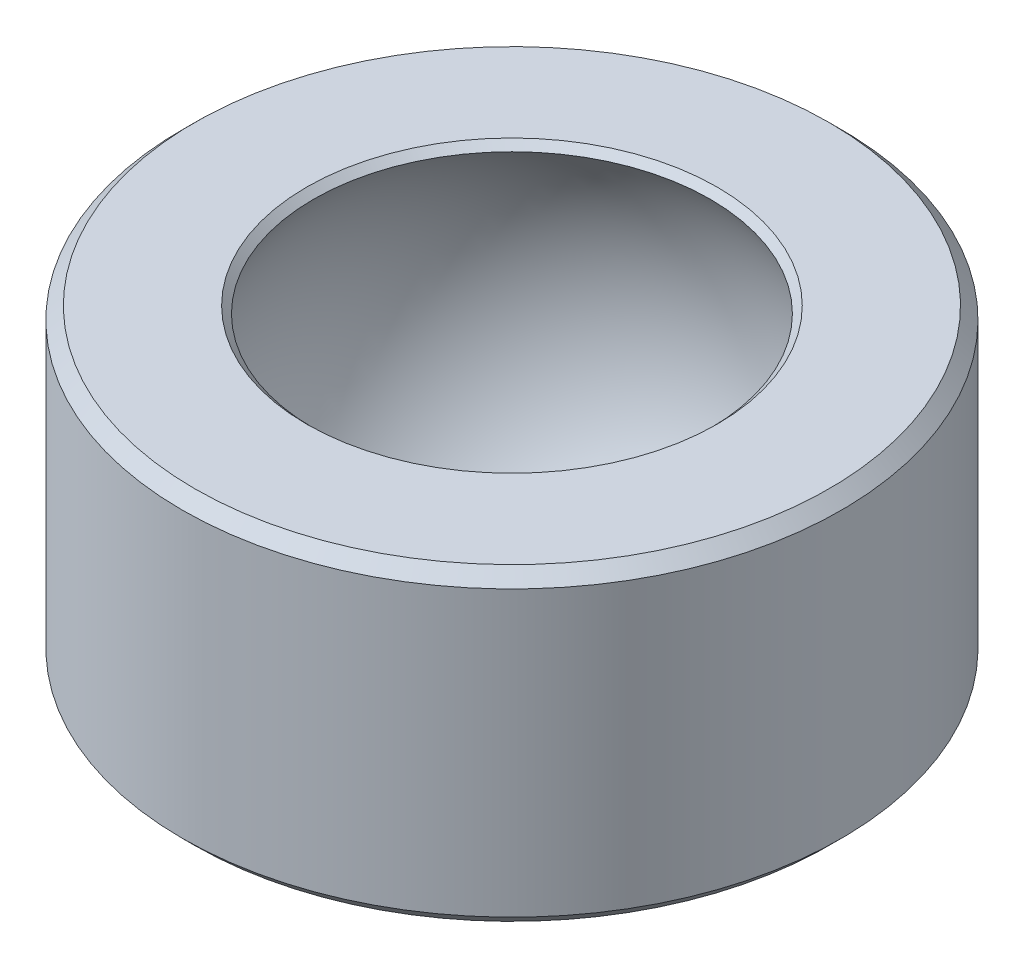
ISO-10303-21;
HEADER;
FILE_DESCRIPTION(('STEP AP214'),'2;1');
FILE_NAME('part.step','',(''),(''),'','','');
FILE_SCHEMA(('AUTOMOTIVE_DESIGN { 1 0 10303 214 1 1 1 1 }'));
ENDSEC;
DATA;
#1=APPLICATION_CONTEXT('core data for automotive mechanical design processes');
#2=APPLICATION_PROTOCOL_DEFINITION('international standard','automotive_design',2000,#1);
#3=PRODUCT_CONTEXT('',#1,'mechanical');
#4=PRODUCT('Part','Part','',(#3));
#5=PRODUCT_RELATED_PRODUCT_CATEGORY('part','',(#4));
#6=PRODUCT_DEFINITION_FORMATION('','',#4);
#7=PRODUCT_DEFINITION_CONTEXT('part definition',#1,'design');
#8=PRODUCT_DEFINITION('design','',#6,#7);
#9=PRODUCT_DEFINITION_SHAPE('','',#8);
#10=(LENGTH_UNIT() NAMED_UNIT(*) SI_UNIT(.MILLI.,.METRE.));
#11=(NAMED_UNIT(*) PLANE_ANGLE_UNIT() SI_UNIT($,.RADIAN.));
#12=(NAMED_UNIT(*) SI_UNIT($,.STERADIAN.) SOLID_ANGLE_UNIT());
#13=UNCERTAINTY_MEASURE_WITH_UNIT(LENGTH_MEASURE(1.E-05),#10,'distance_accuracy_value','');
#14=(GEOMETRIC_REPRESENTATION_CONTEXT(3) GLOBAL_UNCERTAINTY_ASSIGNED_CONTEXT((#13)) GLOBAL_UNIT_ASSIGNED_CONTEXT((#10,
#11,#12)) REPRESENTATION_CONTEXT('',''));
#15=CARTESIAN_POINT('',(0.,0.,0.));
#16=DIRECTION('',(0.,0.,1.));
#17=DIRECTION('',(1.,0.,0.));
#18=AXIS2_PLACEMENT_3D('',#15,#16,#17);
#19=CARTESIAN_POINT('',(0.,-1.875,0.));
#20=DIRECTION('',(0.,1.,0.));
#21=DIRECTION('',(0.,0.,1.));
#22=AXIS2_PLACEMENT_3D('',#19,#20,#21);
#23=CYLINDRICAL_SURFACE('',#22,4.);
#24=CARTESIAN_POINT('',(0.,1.725,0.));
#25=DIRECTION('',(0.,1.,0.));
#26=DIRECTION('',(0.,0.,1.));
#27=AXIS2_PLACEMENT_3D('',#24,#25,#26);
#28=CIRCLE('',#27,4.);
#29=CARTESIAN_POINT('',(0.,1.725,4.));
#30=VERTEX_POINT('',#29);
#31=EDGE_CURVE('E10',#30,#30,#28,.F.);
#32=ORIENTED_EDGE('',*,*,#31,.T.);
#33=EDGE_LOOP('',(#32));
#34=FACE_BOUND('',#33,.T.);
#35=CARTESIAN_POINT('',(0.,-1.725,0.));
#36=DIRECTION('',(0.,1.,0.));
#37=DIRECTION('',(0.,0.,1.));
#38=AXIS2_PLACEMENT_3D('',#35,#36,#37);
#39=CIRCLE('',#38,4.);
#40=CARTESIAN_POINT('',(0.,-1.725,4.));
#41=VERTEX_POINT('',#40);
#42=EDGE_CURVE('E58',#41,#41,#39,.T.);
#43=ORIENTED_EDGE('',*,*,#42,.T.);
#44=EDGE_LOOP('',(#43));
#45=FACE_BOUND('',#44,.T.);
#46=ADVANCED_FACE('F49',(#34,#45),#23,.T.);
#47=CARTESIAN_POINT('',(0.,-1.875,0.));
#48=DIRECTION('',(0.,1.,0.));
#49=DIRECTION('',(0.,0.,1.));
#50=AXIS2_PLACEMENT_3D('',#47,#48,#49);
#51=PLANE('',#50);
#52=CARTESIAN_POINT('',(0.,-1.875,0.));
#53=DIRECTION('',(0.,1.,0.));
#54=DIRECTION('',(0.,0.,1.));
#55=AXIS2_PLACEMENT_3D('',#52,#53,#54);
#56=CIRCLE('',#55,2.44858836354783);
#57=CARTESIAN_POINT('',(0.,-1.875,2.44858836354783));
#58=VERTEX_POINT('',#57);
#59=EDGE_CURVE('E82',#58,#58,#56,.T.);
#60=ORIENTED_EDGE('',*,*,#59,.T.);
#61=EDGE_LOOP('',(#60));
#62=FACE_BOUND('',#61,.T.);
#63=CARTESIAN_POINT('',(0.,-1.875,0.));
#64=DIRECTION('',(0.,1.,0.));
#65=DIRECTION('',(0.,0.,1.));
#66=AXIS2_PLACEMENT_3D('',#63,#64,#65);
#67=CIRCLE('',#66,3.85);
#68=CARTESIAN_POINT('',(0.,-1.875,3.85));
#69=VERTEX_POINT('',#68);
#70=EDGE_CURVE('E86',#69,#69,#67,.F.);
#71=ORIENTED_EDGE('',*,*,#70,.T.);
#72=EDGE_LOOP('',(#71));
#73=FACE_BOUND('',#72,.T.);
#74=ADVANCED_FACE('F91',(#62,#73),#51,.F.);
#75=CARTESIAN_POINT('',(0.,1.875,0.));
#76=DIRECTION('',(0.,1.,0.));
#77=DIRECTION('',(0.,0.,1.));
#78=AXIS2_PLACEMENT_3D('',#75,#76,#77);
#79=PLANE('',#78);
#80=CARTESIAN_POINT('',(0.,1.875,0.));
#81=DIRECTION('',(0.,1.,0.));
#82=DIRECTION('',(0.,0.,1.));
#83=AXIS2_PLACEMENT_3D('',#80,#81,#82);
#84=CIRCLE('',#83,2.4918742493994);
#85=CARTESIAN_POINT('',(0.,1.875,2.4918742493994));
#86=VERTEX_POINT('',#85);
#87=EDGE_CURVE('E63',#86,#86,#84,.F.);
#88=ORIENTED_EDGE('',*,*,#87,.T.);
#89=EDGE_LOOP('',(#88));
#90=FACE_BOUND('',#89,.T.);
#91=CARTESIAN_POINT('',(0.,1.875,0.));
#92=DIRECTION('',(0.,1.,0.));
#93=DIRECTION('',(0.,0.,1.));
#94=AXIS2_PLACEMENT_3D('',#91,#92,#93);
#95=CIRCLE('',#94,3.85);
#96=CARTESIAN_POINT('',(0.,1.875,3.85));
#97=VERTEX_POINT('',#96);
#98=EDGE_CURVE('E68',#97,#97,#95,.T.);
#99=ORIENTED_EDGE('',*,*,#98,.T.);
#100=EDGE_LOOP('',(#99));
#101=FACE_BOUND('',#100,.T.);
#102=ADVANCED_FACE('F106',(#90,#101),#79,.T.);
#103=CARTESIAN_POINT('',(0.,0.,0.));
#104=DIRECTION('',(0.,0.,-1.));
#105=DIRECTION('',(1.,0.,0.));
#106=AXIS2_PLACEMENT_3D('',#103,#104,#105);
#107=SPHERICAL_SURFACE('',#106,3.);
#108=CARTESIAN_POINT('',(0.,0.,0.));
#109=DIRECTION('',(0.,1.,0.));
#110=DIRECTION('',(0.,0.,1.));
#111=AXIS2_PLACEMENT_3D('',#108,#109,#110);
#112=SPHERICAL_SURFACE('',#111,3.);
#113=CARTESIAN_POINT('',(0.,-1.75235006248991,0.));
#114=DIRECTION('',(0.,1.,0.));
#115=DIRECTION('',(0.,0.,1.));
#116=AXIS2_PLACEMENT_3D('',#113,#114,#115);
#117=CIRCLE('',#116,2.435009087969);
#118=CARTESIAN_POINT('',(0.,-1.75235006248991,2.435009087969));
#119=VERTEX_POINT('',#118);
#120=EDGE_CURVE('E74',#119,#119,#117,.F.);
#121=ORIENTED_EDGE('',*,*,#120,.T.);
#122=EDGE_LOOP('',(#121));
#123=FACE_BOUND('',#122,.T.);
#124=CARTESIAN_POINT('',(0.,1.79034026704698,0.));
#125=DIRECTION('',(0.,-1.,0.));
#126=DIRECTION('',(0.,0.,-1.));
#127=AXIS2_PLACEMENT_3D('',#124,#125,#126);
#128=CIRCLE('',#127,2.40721451644638);
#129=CARTESIAN_POINT('',(0.,1.79034026704698,-2.40721451644638));
#130=VERTEX_POINT('',#129);
#131=EDGE_CURVE('E78',#130,#130,#128,.F.);
#132=ORIENTED_EDGE('',*,*,#131,.T.);
#133=EDGE_LOOP('',(#132));
#134=FACE_BOUND('',#133,.T.);
#135=ADVANCED_FACE('F118',(#123,#134),#112,.F.);
#136=CARTESIAN_POINT('',(0.,-1.875,0.));
#137=DIRECTION('',(0.,-1.,0.));
#138=DIRECTION('',(0.,0.,-1.));
#139=AXIS2_PLACEMENT_3D('',#136,#137,#138);
#140=CONICAL_SURFACE('',#139,2.44858836354783,0.110266630460418);
#141=ORIENTED_EDGE('',*,*,#120,.F.);
#142=EDGE_LOOP('',(#141));
#143=FACE_BOUND('',#142,.T.);
#144=ORIENTED_EDGE('',*,*,#59,.F.);
#145=EDGE_LOOP('',(#144));
#146=FACE_BOUND('',#145,.T.);
#147=ADVANCED_FACE('F112',(#143,#146),#140,.F.);
#148=CARTESIAN_POINT('',(0.,1.79034026704698,0.));
#149=DIRECTION('',(0.,1.,0.));
#150=DIRECTION('',(0.,0.,1.));
#151=AXIS2_PLACEMENT_3D('',#148,#149,#150);
#152=CONICAL_SURFACE('',#151,2.40721451644638,0.785398163397461);
#153=ORIENTED_EDGE('',*,*,#87,.F.);
#154=EDGE_LOOP('',(#153));
#155=FACE_BOUND('',#154,.T.);
#156=ORIENTED_EDGE('',*,*,#131,.F.);
#157=EDGE_LOOP('',(#156));
#158=FACE_BOUND('',#157,.T.);
#159=ADVANCED_FACE('F99',(#155,#158),#152,.F.);
#160=CARTESIAN_POINT('',(0.,1.875,0.));
#161=DIRECTION('',(0.,-1.,0.));
#162=DIRECTION('',(0.,0.,-1.));
#163=AXIS2_PLACEMENT_3D('',#160,#161,#162);
#164=CONICAL_SURFACE('',#163,3.85,0.785398163397451);
#165=ORIENTED_EDGE('',*,*,#31,.F.);
#166=EDGE_LOOP('',(#165));
#167=FACE_BOUND('',#166,.T.);
#168=ORIENTED_EDGE('',*,*,#98,.F.);
#169=EDGE_LOOP('',(#168));
#170=FACE_BOUND('',#169,.T.);
#171=ADVANCED_FACE('F95',(#167,#170),#164,.T.);
#172=CARTESIAN_POINT('',(0.,-1.725,0.));
#173=DIRECTION('',(0.,1.,0.));
#174=DIRECTION('',(0.,0.,1.));
#175=AXIS2_PLACEMENT_3D('',#172,#173,#174);
#176=CONICAL_SURFACE('',#175,4.,0.785398163397445);
#177=ORIENTED_EDGE('',*,*,#70,.F.);
#178=EDGE_LOOP('',(#177));
#179=FACE_BOUND('',#178,.T.);
#180=ORIENTED_EDGE('',*,*,#42,.F.);
#181=EDGE_LOOP('',(#180));
#182=FACE_BOUND('',#181,.T.);
#183=ADVANCED_FACE('F52',(#179,#182),#176,.T.);
#184=CLOSED_SHELL('',(#46,#74,#102,#135,#147,#159,#171,#183));
#185=MANIFOLD_SOLID_BREP('B2',#184);
#186=ADVANCED_BREP_SHAPE_REPRESENTATION('',(#18,#185),#14);
#187=SHAPE_DEFINITION_REPRESENTATION(#9,#186);
ENDSEC;
END-ISO-10303-21;
